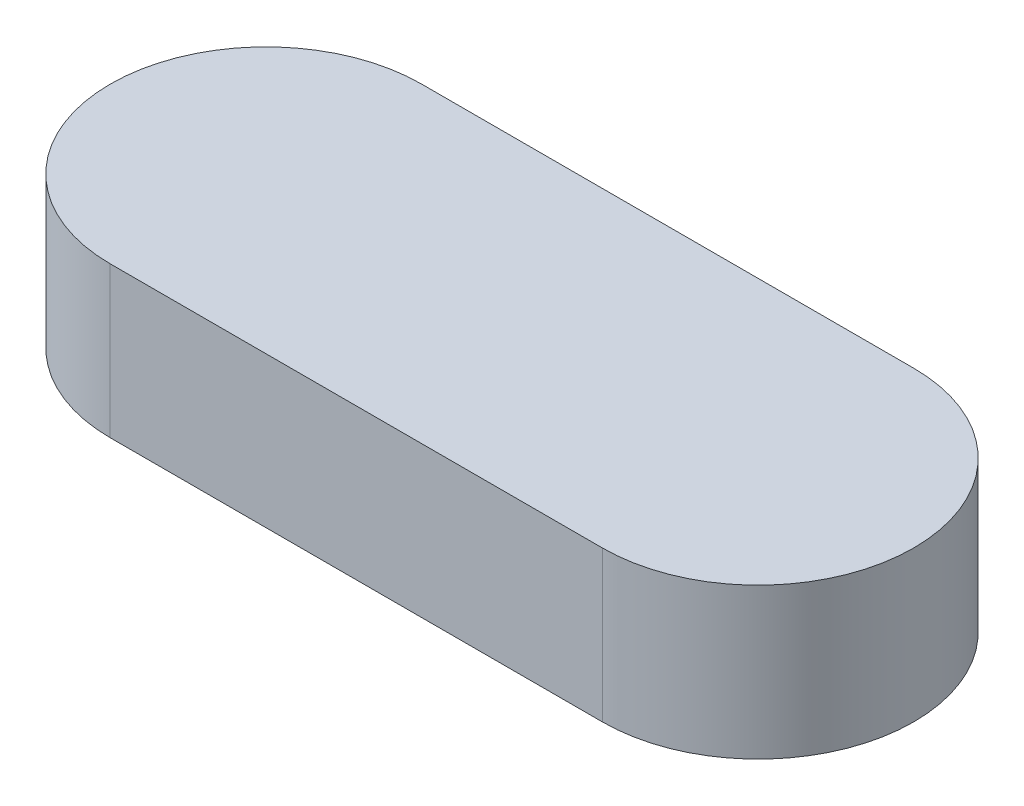
ISO-10303-21;
HEADER;
FILE_DESCRIPTION(('STEP AP214'),'2;1');
FILE_NAME('part.step','',(''),(''),'','','');
FILE_SCHEMA(('AUTOMOTIVE_DESIGN { 1 0 10303 214 1 1 1 1 }'));
ENDSEC;
DATA;
#1=APPLICATION_CONTEXT('core data for automotive mechanical design processes');
#2=APPLICATION_PROTOCOL_DEFINITION('international standard','automotive_design',2000,#1);
#3=PRODUCT_CONTEXT('',#1,'mechanical');
#4=PRODUCT('Part','Part','',(#3));
#5=PRODUCT_RELATED_PRODUCT_CATEGORY('part','',(#4));
#6=PRODUCT_DEFINITION_FORMATION('','',#4);
#7=PRODUCT_DEFINITION_CONTEXT('part definition',#1,'design');
#8=PRODUCT_DEFINITION('design','',#6,#7);
#9=PRODUCT_DEFINITION_SHAPE('','',#8);
#10=(LENGTH_UNIT() NAMED_UNIT(*) SI_UNIT(.MILLI.,.METRE.));
#11=(NAMED_UNIT(*) PLANE_ANGLE_UNIT() SI_UNIT($,.RADIAN.));
#12=(NAMED_UNIT(*) SI_UNIT($,.STERADIAN.) SOLID_ANGLE_UNIT());
#13=UNCERTAINTY_MEASURE_WITH_UNIT(LENGTH_MEASURE(1.E-05),#10,'distance_accuracy_value','');
#14=(GEOMETRIC_REPRESENTATION_CONTEXT(3) GLOBAL_UNCERTAINTY_ASSIGNED_CONTEXT((#13)) GLOBAL_UNIT_ASSIGNED_CONTEXT((#10,
#11,#12)) REPRESENTATION_CONTEXT('',''));
#15=CARTESIAN_POINT('',(0.,0.,0.));
#16=DIRECTION('',(0.,0.,1.));
#17=DIRECTION('',(1.,0.,0.));
#18=AXIS2_PLACEMENT_3D('',#15,#16,#17);
#19=CARTESIAN_POINT('',(-12.25,7.5,0.));
#20=DIRECTION('',(0.,-1.,0.));
#21=DIRECTION('',(0.,0.,-1.));
#22=AXIS2_PLACEMENT_3D('',#19,#20,#21);
#23=CYLINDRICAL_SURFACE('',#22,7.75);
#24=CARTESIAN_POINT('',(-12.25,0.,0.));
#25=DIRECTION('',(0.,1.,0.));
#26=DIRECTION('',(0.,0.,1.));
#27=AXIS2_PLACEMENT_3D('',#24,#25,#26);
#28=CIRCLE('',#27,7.75);
#29=CARTESIAN_POINT('',(-12.25,0.,-7.75));
#30=VERTEX_POINT('',#29);
#31=CARTESIAN_POINT('',(-12.25,0.,7.75));
#32=VERTEX_POINT('',#31);
#33=EDGE_CURVE('E113',#30,#32,#28,.T.);
#34=ORIENTED_EDGE('',*,*,#33,.T.);
#35=DIRECTION('',(0.,-1.,0.));
#36=VECTOR('',#35,1.);
#37=CARTESIAN_POINT('',(-12.25,7.5,7.75));
#38=LINE('',#37,#36);
#39=CARTESIAN_POINT('',(-12.25,7.5,7.75));
#40=VERTEX_POINT('',#39);
#41=EDGE_CURVE('E11',#40,#32,#38,.T.);
#42=ORIENTED_EDGE('',*,*,#41,.F.);
#43=CARTESIAN_POINT('',(-12.25,7.5,0.));
#44=DIRECTION('',(0.,1.,0.));
#45=DIRECTION('',(0.,0.,1.));
#46=AXIS2_PLACEMENT_3D('',#43,#44,#45);
#47=CIRCLE('',#46,7.75);
#48=CARTESIAN_POINT('',(-12.25,7.5,-7.75));
#49=VERTEX_POINT('',#48);
#50=EDGE_CURVE('E97',#49,#40,#47,.T.);
#51=ORIENTED_EDGE('',*,*,#50,.F.);
#52=DIRECTION('',(0.,-1.,0.));
#53=VECTOR('',#52,1.);
#54=CARTESIAN_POINT('',(-12.25,7.5,-7.75));
#55=LINE('',#54,#53);
#56=EDGE_CURVE('E109',#49,#30,#55,.T.);
#57=ORIENTED_EDGE('',*,*,#56,.T.);
#58=EDGE_LOOP('',(#34,#42,#51,#57));
#59=FACE_BOUND('',#58,.T.);
#60=ADVANCED_FACE('F45',(#59),#23,.T.);
#61=CARTESIAN_POINT('',(-12.25,7.5,7.75));
#62=DIRECTION('',(0.,0.,-1.));
#63=DIRECTION('',(-1.,0.,0.));
#64=AXIS2_PLACEMENT_3D('',#61,#62,#63);
#65=PLANE('',#64);
#66=DIRECTION('',(1.,0.,0.));
#67=VECTOR('',#66,1.);
#68=CARTESIAN_POINT('',(-12.25,0.,7.75));
#69=LINE('',#68,#67);
#70=CARTESIAN_POINT('',(12.25,0.,7.75));
#71=VERTEX_POINT('',#70);
#72=EDGE_CURVE('E102',#32,#71,#69,.T.);
#73=ORIENTED_EDGE('',*,*,#72,.T.);
#74=DIRECTION('',(0.,-1.,0.));
#75=VECTOR('',#74,1.);
#76=CARTESIAN_POINT('',(12.25,7.5,7.75));
#77=LINE('',#76,#75);
#78=CARTESIAN_POINT('',(12.25,7.5,7.75));
#79=VERTEX_POINT('',#78);
#80=EDGE_CURVE('E54',#79,#71,#77,.T.);
#81=ORIENTED_EDGE('',*,*,#80,.F.);
#82=DIRECTION('',(1.,0.,0.));
#83=VECTOR('',#82,1.);
#84=CARTESIAN_POINT('',(-12.25,7.5,7.75));
#85=LINE('',#84,#83);
#86=EDGE_CURVE('E92',#40,#79,#85,.T.);
#87=ORIENTED_EDGE('',*,*,#86,.F.);
#88=ORIENTED_EDGE('',*,*,#41,.T.);
#89=EDGE_LOOP('',(#73,#81,#87,#88));
#90=FACE_BOUND('',#89,.T.);
#91=ADVANCED_FACE('F101',(#90),#65,.F.);
#92=CARTESIAN_POINT('',(12.25,7.5,0.));
#93=DIRECTION('',(0.,-1.,0.));
#94=DIRECTION('',(0.,0.,-1.));
#95=AXIS2_PLACEMENT_3D('',#92,#93,#94);
#96=CYLINDRICAL_SURFACE('',#95,7.75);
#97=CARTESIAN_POINT('',(12.25,0.,0.));
#98=DIRECTION('',(0.,1.,0.));
#99=DIRECTION('',(0.,0.,1.));
#100=AXIS2_PLACEMENT_3D('',#97,#98,#99);
#101=CIRCLE('',#100,7.75);
#102=CARTESIAN_POINT('',(12.25,0.,-7.75));
#103=VERTEX_POINT('',#102);
#104=EDGE_CURVE('E79',#71,#103,#101,.T.);
#105=ORIENTED_EDGE('',*,*,#104,.T.);
#106=DIRECTION('',(0.,-1.,0.));
#107=VECTOR('',#106,1.);
#108=CARTESIAN_POINT('',(12.25,7.5,-7.75));
#109=LINE('',#108,#107);
#110=CARTESIAN_POINT('',(12.25,7.5,-7.75));
#111=VERTEX_POINT('',#110);
#112=EDGE_CURVE('E104',#111,#103,#109,.T.);
#113=ORIENTED_EDGE('',*,*,#112,.F.);
#114=CARTESIAN_POINT('',(12.25,7.5,0.));
#115=DIRECTION('',(0.,1.,0.));
#116=DIRECTION('',(0.,0.,1.));
#117=AXIS2_PLACEMENT_3D('',#114,#115,#116);
#118=CIRCLE('',#117,7.75);
#119=EDGE_CURVE('E95',#79,#111,#118,.T.);
#120=ORIENTED_EDGE('',*,*,#119,.F.);
#121=ORIENTED_EDGE('',*,*,#80,.T.);
#122=EDGE_LOOP('',(#105,#113,#120,#121));
#123=FACE_BOUND('',#122,.T.);
#124=ADVANCED_FACE('F105',(#123),#96,.T.);
#125=CARTESIAN_POINT('',(-12.25,7.5,-7.75));
#126=DIRECTION('',(0.,0.,1.));
#127=DIRECTION('',(1.,0.,0.));
#128=AXIS2_PLACEMENT_3D('',#125,#126,#127);
#129=PLANE('',#128);
#130=DIRECTION('',(-1.,0.,0.));
#131=VECTOR('',#130,1.);
#132=CARTESIAN_POINT('',(-12.25,0.,-7.75));
#133=LINE('',#132,#131);
#134=EDGE_CURVE('E85',#103,#30,#133,.T.);
#135=ORIENTED_EDGE('',*,*,#134,.T.);
#136=ORIENTED_EDGE('',*,*,#56,.F.);
#137=DIRECTION('',(-1.,0.,0.));
#138=VECTOR('',#137,1.);
#139=CARTESIAN_POINT('',(-12.25,7.5,-7.75));
#140=LINE('',#139,#138);
#141=EDGE_CURVE('E62',#111,#49,#140,.T.);
#142=ORIENTED_EDGE('',*,*,#141,.F.);
#143=ORIENTED_EDGE('',*,*,#112,.T.);
#144=EDGE_LOOP('',(#135,#136,#142,#143));
#145=FACE_BOUND('',#144,.T.);
#146=ADVANCED_FACE('F126',(#145),#129,.F.);
#147=CARTESIAN_POINT('',(-12.25,7.5,0.));
#148=DIRECTION('',(0.,1.,0.));
#149=DIRECTION('',(0.,0.,1.));
#150=AXIS2_PLACEMENT_3D('',#147,#148,#149);
#151=PLANE('',#150);
#152=ORIENTED_EDGE('',*,*,#50,.T.);
#153=ORIENTED_EDGE('',*,*,#86,.T.);
#154=ORIENTED_EDGE('',*,*,#119,.T.);
#155=ORIENTED_EDGE('',*,*,#141,.T.);
#156=EDGE_LOOP('',(#152,#153,#154,#155));
#157=FACE_BOUND('',#156,.T.);
#158=ADVANCED_FACE('F93',(#157),#151,.T.);
#159=CARTESIAN_POINT('',(-12.25,0.,0.));
#160=DIRECTION('',(0.,1.,0.));
#161=DIRECTION('',(0.,0.,1.));
#162=AXIS2_PLACEMENT_3D('',#159,#160,#161);
#163=PLANE('',#162);
#164=ORIENTED_EDGE('',*,*,#33,.F.);
#165=ORIENTED_EDGE('',*,*,#134,.F.);
#166=ORIENTED_EDGE('',*,*,#104,.F.);
#167=ORIENTED_EDGE('',*,*,#72,.F.);
#168=EDGE_LOOP('',(#164,#165,#166,#167));
#169=FACE_BOUND('',#168,.T.);
#170=ADVANCED_FACE('F129',(#169),#163,.F.);
#171=CLOSED_SHELL('',(#60,#91,#124,#146,#158,#170));
#172=MANIFOLD_SOLID_BREP('B2',#171);
#173=ADVANCED_BREP_SHAPE_REPRESENTATION('',(#18,#172),#14);
#174=SHAPE_DEFINITION_REPRESENTATION(#9,#173);
ENDSEC;
END-ISO-10303-21;
